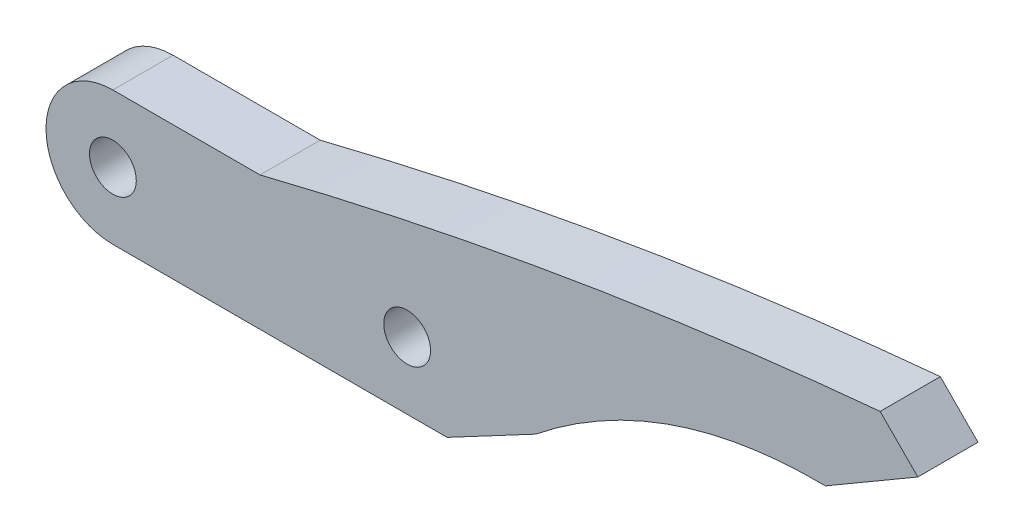
ISO-10303-21;
HEADER;
FILE_DESCRIPTION(('STEP AP214'),'2;1');
FILE_NAME('part.step','',(''),(''),'','','');
FILE_SCHEMA(('AUTOMOTIVE_DESIGN { 1 0 10303 214 1 1 1 1 }'));
ENDSEC;
DATA;
#1=APPLICATION_CONTEXT('core data for automotive mechanical design processes');
#2=APPLICATION_PROTOCOL_DEFINITION('international standard','automotive_design',2000,#1);
#3=PRODUCT_CONTEXT('',#1,'mechanical');
#4=PRODUCT('Part','Part','',(#3));
#5=PRODUCT_RELATED_PRODUCT_CATEGORY('part','',(#4));
#6=PRODUCT_DEFINITION_FORMATION('','',#4);
#7=PRODUCT_DEFINITION_CONTEXT('part definition',#1,'design');
#8=PRODUCT_DEFINITION('design','',#6,#7);
#9=PRODUCT_DEFINITION_SHAPE('','',#8);
#10=(LENGTH_UNIT() NAMED_UNIT(*) SI_UNIT(.MILLI.,.METRE.));
#11=(NAMED_UNIT(*) PLANE_ANGLE_UNIT() SI_UNIT($,.RADIAN.));
#12=(NAMED_UNIT(*) SI_UNIT($,.STERADIAN.) SOLID_ANGLE_UNIT());
#13=UNCERTAINTY_MEASURE_WITH_UNIT(LENGTH_MEASURE(1.E-05),#10,'distance_accuracy_value','');
#14=(GEOMETRIC_REPRESENTATION_CONTEXT(3) GLOBAL_UNCERTAINTY_ASSIGNED_CONTEXT((#13)) GLOBAL_UNIT_ASSIGNED_CONTEXT((#10,
#11,#12)) REPRESENTATION_CONTEXT('',''));
#15=CARTESIAN_POINT('',(0.,0.,0.));
#16=DIRECTION('',(0.,0.,1.));
#17=DIRECTION('',(1.,0.,0.));
#18=AXIS2_PLACEMENT_3D('',#15,#16,#17);
#19=CARTESIAN_POINT('',(0.,5.,4.5));
#20=DIRECTION('',(0.,1.,0.));
#21=DIRECTION('',(-1.,0.,0.));
#22=AXIS2_PLACEMENT_3D('',#19,#20,#21);
#23=PLANE('',#22);
#24=DIRECTION('',(1.,0.,0.));
#25=VECTOR('',#24,1.);
#26=CARTESIAN_POINT('',(0.,5.,4.5));
#27=LINE('',#26,#25);
#28=CARTESIAN_POINT('',(-11.,5.,4.5));
#29=VERTEX_POINT('',#28);
#30=CARTESIAN_POINT('',(0.,5.,4.5));
#31=VERTEX_POINT('',#30);
#32=EDGE_CURVE('E60',#29,#31,#27,.T.);
#33=ORIENTED_EDGE('',*,*,#32,.T.);
#34=DIRECTION('',(0.,0.,1.));
#35=VECTOR('',#34,1.);
#36=CARTESIAN_POINT('',(0.,5.,-52.3267387246767));
#37=LINE('',#36,#35);
#38=CARTESIAN_POINT('',(0.,5.,0.));
#39=VERTEX_POINT('',#38);
#40=EDGE_CURVE('E64',#39,#31,#37,.T.);
#41=ORIENTED_EDGE('',*,*,#40,.F.);
#42=DIRECTION('',(1.,0.,0.));
#43=VECTOR('',#42,1.);
#44=CARTESIAN_POINT('',(0.,5.,0.));
#45=LINE('',#44,#43);
#46=CARTESIAN_POINT('',(-11.,5.,0.));
#47=VERTEX_POINT('',#46);
#48=EDGE_CURVE('E200',#47,#39,#45,.T.);
#49=ORIENTED_EDGE('',*,*,#48,.F.);
#50=DIRECTION('',(0.,0.,-1.));
#51=VECTOR('',#50,1.);
#52=CARTESIAN_POINT('',(-11.,5.,4.5));
#53=LINE('',#52,#51);
#54=EDGE_CURVE('E53',#29,#47,#53,.T.);
#55=ORIENTED_EDGE('',*,*,#54,.F.);
#56=EDGE_LOOP('',(#33,#41,#49,#55));
#57=FACE_BOUND('',#56,.T.);
#58=ADVANCED_FACE('F44',(#57),#23,.T.);
#59=CARTESIAN_POINT('',(-11.,0.,4.5));
#60=DIRECTION('',(0.,0.,-1.));
#61=DIRECTION('',(-1.,0.,0.));
#62=AXIS2_PLACEMENT_3D('',#59,#60,#61);
#63=CYLINDRICAL_SURFACE('',#62,5.);
#64=CARTESIAN_POINT('',(-11.,0.,0.));
#65=DIRECTION('',(0.,0.,1.));
#66=DIRECTION('',(1.,0.,0.));
#67=AXIS2_PLACEMENT_3D('',#64,#65,#66);
#68=CIRCLE('',#67,5.);
#69=CARTESIAN_POINT('',(-11.,-5.,0.));
#70=VERTEX_POINT('',#69);
#71=EDGE_CURVE('E193',#47,#70,#68,.T.);
#72=ORIENTED_EDGE('',*,*,#71,.T.);
#73=DIRECTION('',(0.,0.,-1.));
#74=VECTOR('',#73,1.);
#75=CARTESIAN_POINT('',(-11.,-5.,4.5));
#76=LINE('',#75,#74);
#77=CARTESIAN_POINT('',(-11.,-5.,4.5));
#78=VERTEX_POINT('',#77);
#79=EDGE_CURVE('E11',#78,#70,#76,.T.);
#80=ORIENTED_EDGE('',*,*,#79,.F.);
#81=CARTESIAN_POINT('',(-11.,0.,4.5));
#82=DIRECTION('',(0.,0.,1.));
#83=DIRECTION('',(1.,0.,0.));
#84=AXIS2_PLACEMENT_3D('',#81,#82,#83);
#85=CIRCLE('',#84,5.);
#86=EDGE_CURVE('E118',#29,#78,#85,.T.);
#87=ORIENTED_EDGE('',*,*,#86,.F.);
#88=ORIENTED_EDGE('',*,*,#54,.T.);
#89=EDGE_LOOP('',(#72,#80,#87,#88));
#90=FACE_BOUND('',#89,.T.);
#91=ADVANCED_FACE('F208',(#90),#63,.T.);
#92=CARTESIAN_POINT('',(0.,-5.,4.5));
#93=DIRECTION('',(0.,1.,0.));
#94=DIRECTION('',(-1.,0.,0.));
#95=AXIS2_PLACEMENT_3D('',#92,#93,#94);
#96=PLANE('',#95);
#97=DIRECTION('',(1.,0.,0.));
#98=VECTOR('',#97,1.);
#99=CARTESIAN_POINT('',(0.,-5.,0.));
#100=LINE('',#99,#98);
#101=CARTESIAN_POINT('',(13.99,-5.,0.));
#102=VERTEX_POINT('',#101);
#103=EDGE_CURVE('E126',#70,#102,#100,.T.);
#104=ORIENTED_EDGE('',*,*,#103,.T.);
#105=DIRECTION('',(0.,0.,1.));
#106=VECTOR('',#105,1.);
#107=CARTESIAN_POINT('',(13.99,-5.,-52.3267387246767));
#108=LINE('',#107,#106);
#109=CARTESIAN_POINT('',(13.99,-5.,4.5));
#110=VERTEX_POINT('',#109);
#111=EDGE_CURVE('E124',#102,#110,#108,.T.);
#112=ORIENTED_EDGE('',*,*,#111,.T.);
#113=DIRECTION('',(1.,0.,0.));
#114=VECTOR('',#113,1.);
#115=CARTESIAN_POINT('',(0.,-5.,4.5));
#116=LINE('',#115,#114);
#117=EDGE_CURVE('E109',#78,#110,#116,.T.);
#118=ORIENTED_EDGE('',*,*,#117,.F.);
#119=ORIENTED_EDGE('',*,*,#79,.T.);
#120=EDGE_LOOP('',(#104,#112,#118,#119));
#121=FACE_BOUND('',#120,.T.);
#122=ADVANCED_FACE('F125',(#121),#96,.F.);
#123=CARTESIAN_POINT('',(-11.,0.,4.5));
#124=DIRECTION('',(0.,0.,-1.));
#125=DIRECTION('',(-1.,0.,0.));
#126=AXIS2_PLACEMENT_3D('',#123,#124,#125);
#127=CYLINDRICAL_SURFACE('',#126,1.75);
#128=CARTESIAN_POINT('',(-11.,0.,4.5));
#129=DIRECTION('',(0.,0.,1.));
#130=DIRECTION('',(1.,0.,0.));
#131=AXIS2_PLACEMENT_3D('',#128,#129,#130);
#132=CIRCLE('',#131,1.75);
#133=CARTESIAN_POINT('',(-9.25,0.,4.5));
#134=VERTEX_POINT('',#133);
#135=EDGE_CURVE('E176',#134,#134,#132,.T.);
#136=ORIENTED_EDGE('',*,*,#135,.T.);
#137=EDGE_LOOP('',(#136));
#138=FACE_BOUND('',#137,.T.);
#139=CARTESIAN_POINT('',(-11.,0.,0.));
#140=DIRECTION('',(0.,0.,1.));
#141=DIRECTION('',(1.,0.,0.));
#142=AXIS2_PLACEMENT_3D('',#139,#140,#141);
#143=CIRCLE('',#142,1.75);
#144=CARTESIAN_POINT('',(-9.25,0.,0.));
#145=VERTEX_POINT('',#144);
#146=EDGE_CURVE('E189',#145,#145,#143,.T.);
#147=ORIENTED_EDGE('',*,*,#146,.F.);
#148=EDGE_LOOP('',(#147));
#149=FACE_BOUND('',#148,.T.);
#150=ADVANCED_FACE('F46',(#138,#149),#127,.F.);
#151=CARTESIAN_POINT('',(11.,0.,4.5));
#152=DIRECTION('',(0.,0.,-1.));
#153=DIRECTION('',(-1.,0.,0.));
#154=AXIS2_PLACEMENT_3D('',#151,#152,#153);
#155=CYLINDRICAL_SURFACE('',#154,1.75);
#156=CARTESIAN_POINT('',(11.,0.,4.5));
#157=DIRECTION('',(0.,0.,1.));
#158=DIRECTION('',(1.,0.,0.));
#159=AXIS2_PLACEMENT_3D('',#156,#157,#158);
#160=CIRCLE('',#159,1.75);
#161=CARTESIAN_POINT('',(12.75,0.,4.5));
#162=VERTEX_POINT('',#161);
#163=EDGE_CURVE('E185',#162,#162,#160,.T.);
#164=ORIENTED_EDGE('',*,*,#163,.T.);
#165=EDGE_LOOP('',(#164));
#166=FACE_BOUND('',#165,.T.);
#167=CARTESIAN_POINT('',(11.,0.,0.));
#168=DIRECTION('',(0.,0.,1.));
#169=DIRECTION('',(1.,0.,0.));
#170=AXIS2_PLACEMENT_3D('',#167,#168,#169);
#171=CIRCLE('',#170,1.75);
#172=CARTESIAN_POINT('',(12.75,0.,0.));
#173=VERTEX_POINT('',#172);
#174=EDGE_CURVE('E180',#173,#173,#171,.T.);
#175=ORIENTED_EDGE('',*,*,#174,.F.);
#176=EDGE_LOOP('',(#175));
#177=FACE_BOUND('',#176,.T.);
#178=ADVANCED_FACE('F220',(#166,#177),#155,.F.);
#179=CARTESIAN_POINT('',(0.,0.,4.5));
#180=DIRECTION('',(0.,0.,1.));
#181=DIRECTION('',(1.,0.,0.));
#182=AXIS2_PLACEMENT_3D('',#179,#180,#181);
#183=PLANE('',#182);
#184=CARTESIAN_POINT('',(0.,5.,4.5));
#185=CARTESIAN_POINT('',(22.8855175011126,10.7079266509718,4.5));
#186=CARTESIAN_POINT('',(46.3639891994318,12.87,4.5));
#187=B_SPLINE_CURVE_WITH_KNOTS('',2,(#184,#185,#186),.UNSPECIFIED.,.F.,.F.,(3,3),(0.,1.),.UNSPECIFIED.);
#188=CARTESIAN_POINT('',(46.3639891994318,12.87,4.5));
#189=VERTEX_POINT('',#188);
#190=EDGE_CURVE('E138',#31,#189,#187,.T.);
#191=ORIENTED_EDGE('',*,*,#190,.F.);
#192=ORIENTED_EDGE('',*,*,#32,.F.);
#193=ORIENTED_EDGE('',*,*,#86,.T.);
#194=ORIENTED_EDGE('',*,*,#117,.T.);
#195=DIRECTION('',(-0.882942972945771,-0.469480251475698,0.));
#196=VECTOR('',#195,1.);
#197=CARTESIAN_POINT('',(5.15618121918072,-9.69713627016373,4.5));
#198=LINE('',#197,#196);
#199=CARTESIAN_POINT('',(20.61,-1.48,4.5));
#200=VERTEX_POINT('',#199);
#201=EDGE_CURVE('E116',#200,#110,#198,.T.);
#202=ORIENTED_EDGE('',*,*,#201,.F.);
#203=CARTESIAN_POINT('',(42.27,6.,4.5));
#204=CARTESIAN_POINT('',(30.1461507480522,6.15734830451268,4.5));
#205=CARTESIAN_POINT('',(20.61,-1.48,4.5));
#206=B_SPLINE_CURVE_WITH_KNOTS('',2,(#203,#204,#205),.UNSPECIFIED.,.F.,.F.,(3,3),(0.,1.),.UNSPECIFIED.);
#207=CARTESIAN_POINT('',(42.27,5.99999999999999,4.5));
#208=VERTEX_POINT('',#207);
#209=EDGE_CURVE('E137',#208,#200,#206,.T.);
#210=ORIENTED_EDGE('',*,*,#209,.F.);
#211=DIRECTION('',(-0.86384948775814,-0.50375,0.));
#212=VECTOR('',#211,1.);
#213=CARTESIAN_POINT('',(8.11562184512603,-13.9169742406965,4.5));
#214=LINE('',#213,#212);
#215=CARTESIAN_POINT('',(49.1807959020651,10.03,4.5));
#216=VERTEX_POINT('',#215);
#217=EDGE_CURVE('E142',#216,#208,#214,.T.);
#218=ORIENTED_EDGE('',*,*,#217,.F.);
#219=DIRECTION('',(0.704201675658331,-0.709999999999999,0.));
#220=VECTOR('',#219,1.);
#221=CARTESIAN_POINT('',(29.8068706070966,29.5634482079557,4.5));
#222=LINE('',#221,#220);
#223=EDGE_CURVE('E158',#189,#216,#222,.T.);
#224=ORIENTED_EDGE('',*,*,#223,.F.);
#225=EDGE_LOOP('',(#191,#192,#193,#194,#202,#210,#218,#224));
#226=FACE_BOUND('',#225,.T.);
#227=ORIENTED_EDGE('',*,*,#135,.F.);
#228=EDGE_LOOP('',(#227));
#229=FACE_BOUND('',#228,.T.);
#230=ORIENTED_EDGE('',*,*,#163,.F.);
#231=EDGE_LOOP('',(#230));
#232=FACE_BOUND('',#231,.T.);
#233=ADVANCED_FACE('F112',(#226,#229,#232),#183,.T.);
#234=CARTESIAN_POINT('',(0.,0.,0.));
#235=DIRECTION('',(0.,0.,1.));
#236=DIRECTION('',(1.,0.,0.));
#237=AXIS2_PLACEMENT_3D('',#234,#235,#236);
#238=PLANE('',#237);
#239=ORIENTED_EDGE('',*,*,#146,.T.);
#240=EDGE_LOOP('',(#239));
#241=FACE_BOUND('',#240,.T.);
#242=ORIENTED_EDGE('',*,*,#71,.F.);
#243=ORIENTED_EDGE('',*,*,#48,.T.);
#244=CARTESIAN_POINT('',(0.,5.,0.));
#245=CARTESIAN_POINT('',(22.8855175011126,10.7079266509718,0.));
#246=CARTESIAN_POINT('',(46.3639891994318,12.87,0.));
#247=B_SPLINE_CURVE_WITH_KNOTS('',2,(#244,#245,#246),.UNSPECIFIED.,.F.,.F.,(3,3),(0.,1.),.UNSPECIFIED.);
#248=CARTESIAN_POINT('',(46.3639891994318,12.87,0.));
#249=VERTEX_POINT('',#248);
#250=EDGE_CURVE('E194',#249,#39,#247,.F.);
#251=ORIENTED_EDGE('',*,*,#250,.F.);
#252=DIRECTION('',(-0.704201675658331,0.709999999999999,0.));
#253=VECTOR('',#252,1.);
#254=CARTESIAN_POINT('',(29.8068706070966,29.5634482079557,0.));
#255=LINE('',#254,#253);
#256=CARTESIAN_POINT('',(49.1807959020651,10.03,0.));
#257=VERTEX_POINT('',#256);
#258=EDGE_CURVE('E280',#257,#249,#255,.T.);
#259=ORIENTED_EDGE('',*,*,#258,.F.);
#260=DIRECTION('',(0.86384948775814,0.50375,0.));
#261=VECTOR('',#260,1.);
#262=CARTESIAN_POINT('',(8.11562184512603,-13.9169742406965,0.));
#263=LINE('',#262,#261);
#264=CARTESIAN_POINT('',(42.27,6.,0.));
#265=VERTEX_POINT('',#264);
#266=EDGE_CURVE('E284',#265,#257,#263,.T.);
#267=ORIENTED_EDGE('',*,*,#266,.F.);
#268=CARTESIAN_POINT('',(42.27,6.,0.));
#269=CARTESIAN_POINT('',(30.1461507480522,6.15734830451268,0.));
#270=CARTESIAN_POINT('',(20.61,-1.48,0.));
#271=B_SPLINE_CURVE_WITH_KNOTS('',2,(#268,#269,#270),.UNSPECIFIED.,.F.,.F.,(3,3),(0.,1.),.UNSPECIFIED.);
#272=CARTESIAN_POINT('',(20.61,-1.48,0.));
#273=VERTEX_POINT('',#272);
#274=EDGE_CURVE('E287',#273,#265,#271,.F.);
#275=ORIENTED_EDGE('',*,*,#274,.F.);
#276=DIRECTION('',(0.882942972945771,0.469480251475697,0.));
#277=VECTOR('',#276,1.);
#278=CARTESIAN_POINT('',(5.15618121918072,-9.69713627016373,0.));
#279=LINE('',#278,#277);
#280=EDGE_CURVE('E165',#102,#273,#279,.T.);
#281=ORIENTED_EDGE('',*,*,#280,.F.);
#282=ORIENTED_EDGE('',*,*,#103,.F.);
#283=EDGE_LOOP('',(#242,#243,#251,#259,#267,#275,#281,#282));
#284=FACE_BOUND('',#283,.T.);
#285=ORIENTED_EDGE('',*,*,#174,.T.);
#286=EDGE_LOOP('',(#285));
#287=FACE_BOUND('',#286,.T.);
#288=ADVANCED_FACE('F210',(#241,#284,#287),#238,.F.);
#289=CARTESIAN_POINT('',(5.15618121918072,-9.69713627016373,-52.3267387246767));
#290=DIRECTION('',(-0.469480251475697,0.882942972945771,0.));
#291=DIRECTION('',(-0.882942972945771,-0.469480251475697,0.));
#292=AXIS2_PLACEMENT_3D('',#289,#290,#291);
#293=PLANE('',#292);
#294=ORIENTED_EDGE('',*,*,#111,.F.);
#295=ORIENTED_EDGE('',*,*,#280,.T.);
#296=DIRECTION('',(0.,0.,1.));
#297=VECTOR('',#296,1.);
#298=CARTESIAN_POINT('',(20.61,-1.48,-52.3267387246767));
#299=LINE('',#298,#297);
#300=EDGE_CURVE('E131',#273,#200,#299,.T.);
#301=ORIENTED_EDGE('',*,*,#300,.T.);
#302=ORIENTED_EDGE('',*,*,#201,.T.);
#303=EDGE_LOOP('',(#294,#295,#301,#302));
#304=FACE_BOUND('',#303,.T.);
#305=ADVANCED_FACE('F133',(#304),#293,.F.);
#306=CARTESIAN_POINT('',(42.27,6.,-52.3267387246767));
#307=CARTESIAN_POINT('',(30.1461507480522,6.15734830451268,-52.3267387246767));
#308=CARTESIAN_POINT('',(20.61,-1.48,-52.3267387246767));
#309=B_SPLINE_CURVE_WITH_KNOTS('',2,(#306,#307,#308),.UNSPECIFIED.,.F.,.F.,(3,3),(0.,1.),.UNSPECIFIED.);
#310=DIRECTION('',(0.,0.,1.));
#311=VECTOR('',#310,1.);
#312=SURFACE_OF_LINEAR_EXTRUSION('',#309,#311);
#313=ORIENTED_EDGE('',*,*,#300,.F.);
#314=ORIENTED_EDGE('',*,*,#274,.T.);
#315=DIRECTION('',(0.,0.,1.));
#316=VECTOR('',#315,1.);
#317=CARTESIAN_POINT('',(42.27,5.99999999999999,-52.3267387246767));
#318=LINE('',#317,#316);
#319=EDGE_CURVE('E169',#265,#208,#318,.T.);
#320=ORIENTED_EDGE('',*,*,#319,.T.);
#321=ORIENTED_EDGE('',*,*,#209,.T.);
#322=EDGE_LOOP('',(#313,#314,#320,#321));
#323=FACE_BOUND('',#322,.T.);
#324=ADVANCED_FACE('F240',(#323),#312,.F.);
#325=CARTESIAN_POINT('',(8.11562184512603,-13.9169742406965,-52.3267387246767));
#326=DIRECTION('',(-0.50375,0.863849487758139,0.));
#327=DIRECTION('',(-0.86384948775814,-0.50375,0.));
#328=AXIS2_PLACEMENT_3D('',#325,#326,#327);
#329=PLANE('',#328);
#330=ORIENTED_EDGE('',*,*,#319,.F.);
#331=ORIENTED_EDGE('',*,*,#266,.T.);
#332=DIRECTION('',(0.,0.,1.));
#333=VECTOR('',#332,1.);
#334=CARTESIAN_POINT('',(49.1807959020651,10.03,-52.3267387246767));
#335=LINE('',#334,#333);
#336=EDGE_CURVE('E166',#257,#216,#335,.T.);
#337=ORIENTED_EDGE('',*,*,#336,.T.);
#338=ORIENTED_EDGE('',*,*,#217,.T.);
#339=EDGE_LOOP('',(#330,#331,#337,#338));
#340=FACE_BOUND('',#339,.T.);
#341=ADVANCED_FACE('F268',(#340),#329,.F.);
#342=CARTESIAN_POINT('',(29.8068706070966,29.5634482079557,-52.3267387246767));
#343=DIRECTION('',(-0.709999999999999,-0.704201675658331,0.));
#344=DIRECTION('',(0.704201675658331,-0.709999999999999,0.));
#345=AXIS2_PLACEMENT_3D('',#342,#343,#344);
#346=PLANE('',#345);
#347=ORIENTED_EDGE('',*,*,#336,.F.);
#348=ORIENTED_EDGE('',*,*,#258,.T.);
#349=DIRECTION('',(0.,0.,1.));
#350=VECTOR('',#349,1.);
#351=CARTESIAN_POINT('',(46.3639891994318,12.87,-52.3267387246767));
#352=LINE('',#351,#350);
#353=EDGE_CURVE('E162',#249,#189,#352,.T.);
#354=ORIENTED_EDGE('',*,*,#353,.T.);
#355=ORIENTED_EDGE('',*,*,#223,.T.);
#356=EDGE_LOOP('',(#347,#348,#354,#355));
#357=FACE_BOUND('',#356,.T.);
#358=ADVANCED_FACE('F247',(#357),#346,.F.);
#359=CARTESIAN_POINT('',(0.,5.,-52.3267387246767));
#360=CARTESIAN_POINT('',(22.8855175011126,10.7079266509718,-52.3267387246767));
#361=CARTESIAN_POINT('',(46.3639891994318,12.87,-52.3267387246767));
#362=B_SPLINE_CURVE_WITH_KNOTS('',2,(#359,#360,#361),.UNSPECIFIED.,.F.,.F.,(3,3),(0.,1.),.UNSPECIFIED.);
#363=DIRECTION('',(0.,0.,1.));
#364=VECTOR('',#363,1.);
#365=SURFACE_OF_LINEAR_EXTRUSION('',#362,#364);
#366=ORIENTED_EDGE('',*,*,#353,.F.);
#367=ORIENTED_EDGE('',*,*,#250,.T.);
#368=ORIENTED_EDGE('',*,*,#40,.T.);
#369=ORIENTED_EDGE('',*,*,#190,.T.);
#370=EDGE_LOOP('',(#366,#367,#368,#369));
#371=FACE_BOUND('',#370,.T.);
#372=ADVANCED_FACE('F244',(#371),#365,.F.);
#373=CLOSED_SHELL('',(#58,#91,#122,#150,#178,#233,#288,#305,#324,#341,#358,#372));
#374=MANIFOLD_SOLID_BREP('B2',#373);
#375=ADVANCED_BREP_SHAPE_REPRESENTATION('',(#18,#374),#14);
#376=SHAPE_DEFINITION_REPRESENTATION(#9,#375);
ENDSEC;
END-ISO-10303-21;
